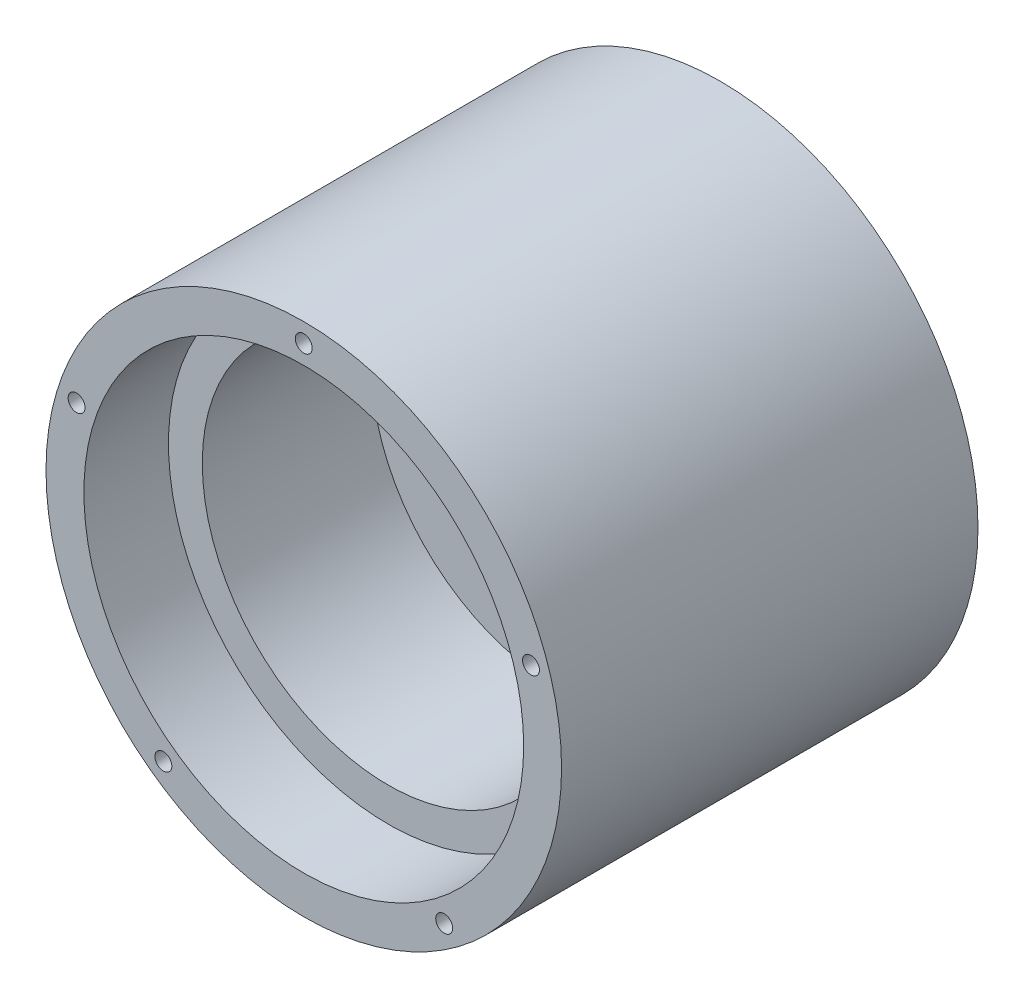
ISO-10303-21;
HEADER;
FILE_DESCRIPTION(('STEP AP214'),'2;1');
FILE_NAME('part.step','',(''),(''),'','','');
FILE_SCHEMA(('AUTOMOTIVE_DESIGN { 1 0 10303 214 1 1 1 1 }'));
ENDSEC;
DATA;
#1=APPLICATION_CONTEXT('core data for automotive mechanical design processes');
#2=APPLICATION_PROTOCOL_DEFINITION('international standard','automotive_design',2000,#1);
#3=PRODUCT_CONTEXT('',#1,'mechanical');
#4=PRODUCT('Part','Part','',(#3));
#5=PRODUCT_RELATED_PRODUCT_CATEGORY('part','',(#4));
#6=PRODUCT_DEFINITION_FORMATION('','',#4);
#7=PRODUCT_DEFINITION_CONTEXT('part definition',#1,'design');
#8=PRODUCT_DEFINITION('design','',#6,#7);
#9=PRODUCT_DEFINITION_SHAPE('','',#8);
#10=(LENGTH_UNIT() NAMED_UNIT(*) SI_UNIT(.MILLI.,.METRE.));
#11=(NAMED_UNIT(*) PLANE_ANGLE_UNIT() SI_UNIT($,.RADIAN.));
#12=(NAMED_UNIT(*) SI_UNIT($,.STERADIAN.) SOLID_ANGLE_UNIT());
#13=UNCERTAINTY_MEASURE_WITH_UNIT(LENGTH_MEASURE(1.E-05),#10,'distance_accuracy_value','');
#14=(GEOMETRIC_REPRESENTATION_CONTEXT(3) GLOBAL_UNCERTAINTY_ASSIGNED_CONTEXT((#13)) GLOBAL_UNIT_ASSIGNED_CONTEXT((#10,
#11,#12)) REPRESENTATION_CONTEXT('',''));
#15=CARTESIAN_POINT('',(0.,0.,0.));
#16=DIRECTION('',(0.,0.,1.));
#17=DIRECTION('',(1.,0.,0.));
#18=AXIS2_PLACEMENT_3D('',#15,#16,#17);
#19=CARTESIAN_POINT('',(0.,0.,85.));
#20=DIRECTION('',(0.,0.,-1.));
#21=DIRECTION('',(-1.,0.,0.));
#22=AXIS2_PLACEMENT_3D('',#19,#20,#21);
#23=CYLINDRICAL_SURFACE('',#22,76.2);
#24=CARTESIAN_POINT('',(0.,0.,85.));
#25=DIRECTION('',(0.,0.,1.));
#26=DIRECTION('',(1.,0.,0.));
#27=AXIS2_PLACEMENT_3D('',#24,#25,#26);
#28=CIRCLE('',#27,76.2);
#29=CARTESIAN_POINT('',(76.2,0.,85.));
#30=VERTEX_POINT('',#29);
#31=EDGE_CURVE('E338',#30,#30,#28,.T.);
#32=ORIENTED_EDGE('',*,*,#31,.F.);
#33=EDGE_LOOP('',(#32));
#34=FACE_BOUND('',#33,.T.);
#35=CARTESIAN_POINT('',(0.,0.,-38.1));
#36=DIRECTION('',(0.,0.,-1.));
#37=DIRECTION('',(-1.,0.,0.));
#38=AXIS2_PLACEMENT_3D('',#35,#36,#37);
#39=CIRCLE('',#38,76.2);
#40=CARTESIAN_POINT('',(-76.2,0.,-38.1));
#41=VERTEX_POINT('',#40);
#42=EDGE_CURVE('E294',#41,#41,#39,.T.);
#43=ORIENTED_EDGE('',*,*,#42,.F.);
#44=EDGE_LOOP('',(#43));
#45=FACE_BOUND('',#44,.T.);
#46=ADVANCED_FACE('F47',(#34,#45),#23,.T.);
#47=CARTESIAN_POINT('',(0.,0.,85.));
#48=DIRECTION('',(0.,0.,1.));
#49=DIRECTION('',(1.,0.,0.));
#50=AXIS2_PLACEMENT_3D('',#47,#48,#49);
#51=PLANE('',#50);
#52=CARTESIAN_POINT('',(-67.1560027286335,21.8203080068036,85.));
#53=DIRECTION('',(0.,0.,1.));
#54=DIRECTION('',(0.309016994374945,0.951056516295155,0.));
#55=AXIS2_PLACEMENT_3D('',#52,#53,#54);
#56=CIRCLE('',#55,2.5);
#57=CARTESIAN_POINT('',(-66.3834602426961,24.1979492975415,85.));
#58=VERTEX_POINT('',#57);
#59=EDGE_CURVE('E303',#58,#58,#56,.T.);
#60=ORIENTED_EDGE('',*,*,#59,.F.);
#61=EDGE_LOOP('',(#60));
#62=FACE_BOUND('',#61,.T.);
#63=CARTESIAN_POINT('',(-41.5046922348758,-57.126308006804,85.));
#64=DIRECTION('',(0.,0.,1.));
#65=DIRECTION('',(-0.809016994374951,0.587785252292469,0.));
#66=AXIS2_PLACEMENT_3D('',#63,#64,#65);
#67=CIRCLE('',#66,2.5);
#68=CARTESIAN_POINT('',(-43.5272347208132,-55.6568448760729,85.));
#69=VERTEX_POINT('',#68);
#70=EDGE_CURVE('E309',#69,#69,#67,.T.);
#71=ORIENTED_EDGE('',*,*,#70,.F.);
#72=EDGE_LOOP('',(#71));
#73=FACE_BOUND('',#72,.T.);
#74=CARTESIAN_POINT('',(41.5046922348766,-57.1263080068034,85.));
#75=DIRECTION('',(0.,0.,1.));
#76=DIRECTION('',(-0.809016994374942,-0.58778525229248,0.));
#77=AXIS2_PLACEMENT_3D('',#74,#75,#76);
#78=CIRCLE('',#77,2.5);
#79=CARTESIAN_POINT('',(39.4821497489393,-58.5957711375346,85.));
#80=VERTEX_POINT('',#79);
#81=EDGE_CURVE('E315',#80,#80,#78,.T.);
#82=ORIENTED_EDGE('',*,*,#81,.F.);
#83=EDGE_LOOP('',(#82));
#84=FACE_BOUND('',#83,.T.);
#85=CARTESIAN_POINT('',(67.1560027286331,21.8203080068045,85.));
#86=DIRECTION('',(0.,0.,1.));
#87=DIRECTION('',(0.309016994374958,-0.95105651629515,0.));
#88=AXIS2_PLACEMENT_3D('',#85,#86,#87);
#89=CIRCLE('',#88,2.5);
#90=CARTESIAN_POINT('',(67.9285452145705,19.4426667160667,85.));
#91=VERTEX_POINT('',#90);
#92=EDGE_CURVE('E298',#91,#91,#89,.T.);
#93=ORIENTED_EDGE('',*,*,#92,.F.);
#94=EDGE_LOOP('',(#93));
#95=FACE_BOUND('',#94,.T.);
#96=CARTESIAN_POINT('',(0.,70.612,85.));
#97=DIRECTION('',(0.,0.,1.));
#98=DIRECTION('',(1.,0.,0.));
#99=AXIS2_PLACEMENT_3D('',#96,#97,#98);
#100=CIRCLE('',#99,2.5);
#101=CARTESIAN_POINT('',(2.5,70.612,85.));
#102=VERTEX_POINT('',#101);
#103=EDGE_CURVE('E302',#102,#102,#100,.T.);
#104=ORIENTED_EDGE('',*,*,#103,.F.);
#105=EDGE_LOOP('',(#104));
#106=FACE_BOUND('',#105,.T.);
#107=CARTESIAN_POINT('',(0.,0.,85.));
#108=DIRECTION('',(0.,0.,1.));
#109=DIRECTION('',(1.,0.,0.));
#110=AXIS2_PLACEMENT_3D('',#107,#108,#109);
#111=CIRCLE('',#110,65.);
#112=CARTESIAN_POINT('',(65.,0.,85.));
#113=VERTEX_POINT('',#112);
#114=EDGE_CURVE('E332',#113,#113,#111,.T.);
#115=ORIENTED_EDGE('',*,*,#114,.F.);
#116=EDGE_LOOP('',(#115));
#117=FACE_BOUND('',#116,.T.);
#118=ORIENTED_EDGE('',*,*,#31,.T.);
#119=EDGE_LOOP('',(#118));
#120=FACE_BOUND('',#119,.T.);
#121=ADVANCED_FACE('F489',(#62,#73,#84,#95,#106,#117,#120),#51,.T.);
#122=CARTESIAN_POINT('',(0.,0.,60.));
#123=DIRECTION('',(0.,0.,1.));
#124=DIRECTION('',(1.,0.,0.));
#125=AXIS2_PLACEMENT_3D('',#122,#123,#124);
#126=CYLINDRICAL_SURFACE('',#125,65.);
#127=CARTESIAN_POINT('',(0.,0.,60.));
#128=DIRECTION('',(0.,0.,1.));
#129=DIRECTION('',(1.,0.,0.));
#130=AXIS2_PLACEMENT_3D('',#127,#128,#129);
#131=CIRCLE('',#130,65.);
#132=CARTESIAN_POINT('',(65.,0.,60.));
#133=VERTEX_POINT('',#132);
#134=EDGE_CURVE('E335',#133,#133,#131,.T.);
#135=ORIENTED_EDGE('',*,*,#134,.F.);
#136=EDGE_LOOP('',(#135));
#137=FACE_BOUND('',#136,.T.);
#138=ORIENTED_EDGE('',*,*,#114,.T.);
#139=EDGE_LOOP('',(#138));
#140=FACE_BOUND('',#139,.T.);
#141=ADVANCED_FACE('F494',(#137,#140),#126,.F.);
#142=CARTESIAN_POINT('',(0.,0.,60.));
#143=DIRECTION('',(0.,0.,1.));
#144=DIRECTION('',(1.,0.,0.));
#145=AXIS2_PLACEMENT_3D('',#142,#143,#144);
#146=PLANE('',#145);
#147=CARTESIAN_POINT('',(0.,0.,60.));
#148=DIRECTION('',(0.,0.,1.));
#149=DIRECTION('',(1.,0.,0.));
#150=AXIS2_PLACEMENT_3D('',#147,#148,#149);
#151=CIRCLE('',#150,55.);
#152=CARTESIAN_POINT('',(55.,0.,60.));
#153=VERTEX_POINT('',#152);
#154=EDGE_CURVE('E326',#153,#153,#151,.T.);
#155=ORIENTED_EDGE('',*,*,#154,.F.);
#156=EDGE_LOOP('',(#155));
#157=FACE_BOUND('',#156,.T.);
#158=ORIENTED_EDGE('',*,*,#134,.T.);
#159=EDGE_LOOP('',(#158));
#160=FACE_BOUND('',#159,.T.);
#161=ADVANCED_FACE('F502',(#157,#160),#146,.T.);
#162=CARTESIAN_POINT('',(0.,0.,10.));
#163=DIRECTION('',(0.,0.,1.));
#164=DIRECTION('',(1.,0.,0.));
#165=AXIS2_PLACEMENT_3D('',#162,#163,#164);
#166=CYLINDRICAL_SURFACE('',#165,55.);
#167=CARTESIAN_POINT('',(0.,0.,10.));
#168=DIRECTION('',(0.,0.,1.));
#169=DIRECTION('',(1.,0.,0.));
#170=AXIS2_PLACEMENT_3D('',#167,#168,#169);
#171=CIRCLE('',#170,55.);
#172=CARTESIAN_POINT('',(55.,0.,10.));
#173=VERTEX_POINT('',#172);
#174=EDGE_CURVE('E329',#173,#173,#171,.T.);
#175=ORIENTED_EDGE('',*,*,#174,.F.);
#176=EDGE_LOOP('',(#175));
#177=FACE_BOUND('',#176,.T.);
#178=ORIENTED_EDGE('',*,*,#154,.T.);
#179=EDGE_LOOP('',(#178));
#180=FACE_BOUND('',#179,.T.);
#181=ADVANCED_FACE('F614',(#177,#180),#166,.F.);
#182=CARTESIAN_POINT('',(0.,0.,10.));
#183=DIRECTION('',(0.,0.,1.));
#184=DIRECTION('',(1.,0.,0.));
#185=AXIS2_PLACEMENT_3D('',#182,#183,#184);
#186=PLANE('',#185);
#187=ORIENTED_EDGE('',*,*,#174,.T.);
#188=EDGE_LOOP('',(#187));
#189=FACE_BOUND('',#188,.T.);
#190=ADVANCED_FACE('F611',(#189),#186,.T.);
#191=CARTESIAN_POINT('',(0.,70.612,65.));
#192=DIRECTION('',(0.,0.,1.));
#193=DIRECTION('',(1.,0.,0.));
#194=AXIS2_PLACEMENT_3D('',#191,#192,#193);
#195=CYLINDRICAL_SURFACE('',#194,2.5);
#196=CARTESIAN_POINT('',(0.,70.612,65.));
#197=DIRECTION('',(0.,0.,1.));
#198=DIRECTION('',(1.,0.,0.));
#199=AXIS2_PLACEMENT_3D('',#196,#197,#198);
#200=CIRCLE('',#199,2.5);
#201=CARTESIAN_POINT('',(2.5,70.612,65.));
#202=VERTEX_POINT('',#201);
#203=EDGE_CURVE('E323',#202,#202,#200,.T.);
#204=ORIENTED_EDGE('',*,*,#203,.F.);
#205=EDGE_LOOP('',(#204));
#206=FACE_BOUND('',#205,.T.);
#207=ORIENTED_EDGE('',*,*,#103,.T.);
#208=EDGE_LOOP('',(#207));
#209=FACE_BOUND('',#208,.T.);
#210=ADVANCED_FACE('F607',(#206,#209),#195,.F.);
#211=CARTESIAN_POINT('',(0.,70.612,65.));
#212=DIRECTION('',(0.,0.,1.));
#213=DIRECTION('',(1.,0.,0.));
#214=AXIS2_PLACEMENT_3D('',#211,#212,#213);
#215=PLANE('',#214);
#216=ORIENTED_EDGE('',*,*,#203,.T.);
#217=EDGE_LOOP('',(#216));
#218=FACE_BOUND('',#217,.T.);
#219=ADVANCED_FACE('F603',(#218),#215,.T.);
#220=CARTESIAN_POINT('',(67.1560027286331,21.8203080068045,65.));
#221=DIRECTION('',(0.,0.,1.));
#222=DIRECTION('',(1.,0.,0.));
#223=AXIS2_PLACEMENT_3D('',#220,#221,#222);
#224=CYLINDRICAL_SURFACE('',#223,2.5);
#225=CARTESIAN_POINT('',(67.1560027286331,21.8203080068045,65.));
#226=DIRECTION('',(0.,0.,1.));
#227=DIRECTION('',(0.309016994374958,-0.95105651629515,0.));
#228=AXIS2_PLACEMENT_3D('',#225,#226,#227);
#229=CIRCLE('',#228,2.5);
#230=CARTESIAN_POINT('',(67.9285452145705,19.4426667160667,65.));
#231=VERTEX_POINT('',#230);
#232=EDGE_CURVE('E318',#231,#231,#229,.T.);
#233=ORIENTED_EDGE('',*,*,#232,.F.);
#234=EDGE_LOOP('',(#233));
#235=FACE_BOUND('',#234,.T.);
#236=ORIENTED_EDGE('',*,*,#92,.T.);
#237=EDGE_LOOP('',(#236));
#238=FACE_BOUND('',#237,.T.);
#239=ADVANCED_FACE('F599',(#235,#238),#224,.F.);
#240=CARTESIAN_POINT('',(67.1560027286331,21.8203080068045,65.));
#241=DIRECTION('',(0.,0.,1.));
#242=DIRECTION('',(0.309016994374958,-0.95105651629515,0.));
#243=AXIS2_PLACEMENT_3D('',#240,#241,#242);
#244=PLANE('',#243);
#245=ORIENTED_EDGE('',*,*,#232,.T.);
#246=EDGE_LOOP('',(#245));
#247=FACE_BOUND('',#246,.T.);
#248=ADVANCED_FACE('F595',(#247),#244,.T.);
#249=CARTESIAN_POINT('',(41.5046922348766,-57.1263080068034,65.));
#250=DIRECTION('',(0.,0.,1.));
#251=DIRECTION('',(1.,0.,0.));
#252=AXIS2_PLACEMENT_3D('',#249,#250,#251);
#253=CYLINDRICAL_SURFACE('',#252,2.5);
#254=CARTESIAN_POINT('',(41.5046922348766,-57.1263080068034,65.));
#255=DIRECTION('',(0.,0.,1.));
#256=DIRECTION('',(-0.809016994374942,-0.58778525229248,0.));
#257=AXIS2_PLACEMENT_3D('',#254,#255,#256);
#258=CIRCLE('',#257,2.5);
#259=CARTESIAN_POINT('',(39.4821497489393,-58.5957711375346,65.));
#260=VERTEX_POINT('',#259);
#261=EDGE_CURVE('E312',#260,#260,#258,.T.);
#262=ORIENTED_EDGE('',*,*,#261,.F.);
#263=EDGE_LOOP('',(#262));
#264=FACE_BOUND('',#263,.T.);
#265=ORIENTED_EDGE('',*,*,#81,.T.);
#266=EDGE_LOOP('',(#265));
#267=FACE_BOUND('',#266,.T.);
#268=ADVANCED_FACE('F591',(#264,#267),#253,.F.);
#269=CARTESIAN_POINT('',(41.5046922348766,-57.1263080068034,65.));
#270=DIRECTION('',(0.,0.,1.));
#271=DIRECTION('',(-0.809016994374942,-0.58778525229248,0.));
#272=AXIS2_PLACEMENT_3D('',#269,#270,#271);
#273=PLANE('',#272);
#274=ORIENTED_EDGE('',*,*,#261,.T.);
#275=EDGE_LOOP('',(#274));
#276=FACE_BOUND('',#275,.T.);
#277=ADVANCED_FACE('F587',(#276),#273,.T.);
#278=CARTESIAN_POINT('',(-41.5046922348758,-57.126308006804,65.));
#279=DIRECTION('',(0.,0.,1.));
#280=DIRECTION('',(1.,0.,0.));
#281=AXIS2_PLACEMENT_3D('',#278,#279,#280);
#282=CYLINDRICAL_SURFACE('',#281,2.5);
#283=CARTESIAN_POINT('',(-41.5046922348758,-57.126308006804,65.));
#284=DIRECTION('',(0.,0.,1.));
#285=DIRECTION('',(-0.809016994374951,0.587785252292469,0.));
#286=AXIS2_PLACEMENT_3D('',#283,#284,#285);
#287=CIRCLE('',#286,2.5);
#288=CARTESIAN_POINT('',(-43.5272347208132,-55.6568448760729,65.));
#289=VERTEX_POINT('',#288);
#290=EDGE_CURVE('E306',#289,#289,#287,.T.);
#291=ORIENTED_EDGE('',*,*,#290,.F.);
#292=EDGE_LOOP('',(#291));
#293=FACE_BOUND('',#292,.T.);
#294=ORIENTED_EDGE('',*,*,#70,.T.);
#295=EDGE_LOOP('',(#294));
#296=FACE_BOUND('',#295,.T.);
#297=ADVANCED_FACE('F583',(#293,#296),#282,.F.);
#298=CARTESIAN_POINT('',(-41.5046922348758,-57.126308006804,65.));
#299=DIRECTION('',(0.,0.,1.));
#300=DIRECTION('',(-0.809016994374951,0.587785252292469,0.));
#301=AXIS2_PLACEMENT_3D('',#298,#299,#300);
#302=PLANE('',#301);
#303=ORIENTED_EDGE('',*,*,#290,.T.);
#304=EDGE_LOOP('',(#303));
#305=FACE_BOUND('',#304,.T.);
#306=ADVANCED_FACE('F579',(#305),#302,.T.);
#307=CARTESIAN_POINT('',(-67.1560027286335,21.8203080068036,65.));
#308=DIRECTION('',(0.,0.,1.));
#309=DIRECTION('',(1.,0.,0.));
#310=AXIS2_PLACEMENT_3D('',#307,#308,#309);
#311=CYLINDRICAL_SURFACE('',#310,2.5);
#312=CARTESIAN_POINT('',(-67.1560027286335,21.8203080068036,65.));
#313=DIRECTION('',(0.,0.,1.));
#314=DIRECTION('',(0.309016994374945,0.951056516295155,0.));
#315=AXIS2_PLACEMENT_3D('',#312,#313,#314);
#316=CIRCLE('',#315,2.5);
#317=CARTESIAN_POINT('',(-66.3834602426961,24.1979492975415,65.));
#318=VERTEX_POINT('',#317);
#319=EDGE_CURVE('E299',#318,#318,#316,.T.);
#320=ORIENTED_EDGE('',*,*,#319,.F.);
#321=EDGE_LOOP('',(#320));
#322=FACE_BOUND('',#321,.T.);
#323=ORIENTED_EDGE('',*,*,#59,.T.);
#324=EDGE_LOOP('',(#323));
#325=FACE_BOUND('',#324,.T.);
#326=ADVANCED_FACE('F575',(#322,#325),#311,.F.);
#327=CARTESIAN_POINT('',(-67.1560027286335,21.8203080068036,65.));
#328=DIRECTION('',(0.,0.,1.));
#329=DIRECTION('',(0.309016994374945,0.951056516295155,0.));
#330=AXIS2_PLACEMENT_3D('',#327,#328,#329);
#331=PLANE('',#330);
#332=ORIENTED_EDGE('',*,*,#319,.T.);
#333=EDGE_LOOP('',(#332));
#334=FACE_BOUND('',#333,.T.);
#335=ADVANCED_FACE('F484',(#334),#331,.T.);
#336=CARTESIAN_POINT('',(0.,0.,-38.1));
#337=DIRECTION('',(0.,0.,-1.));
#338=DIRECTION('',(-1.,0.,0.));
#339=AXIS2_PLACEMENT_3D('',#336,#337,#338);
#340=PLANE('',#339);
#341=CARTESIAN_POINT('',(0.,0.,-38.1));
#342=DIRECTION('',(0.,0.,-1.));
#343=DIRECTION('',(-1.,0.,0.));
#344=AXIS2_PLACEMENT_3D('',#341,#342,#343);
#345=CIRCLE('',#344,69.85);
#346=CARTESIAN_POINT('',(-69.85,0.,-38.1));
#347=VERTEX_POINT('',#346);
#348=EDGE_CURVE('E469',#347,#347,#345,.T.);
#349=ORIENTED_EDGE('',*,*,#348,.F.);
#350=EDGE_LOOP('',(#349));
#351=FACE_BOUND('',#350,.T.);
#352=ORIENTED_EDGE('',*,*,#42,.T.);
#353=EDGE_LOOP('',(#352));
#354=FACE_BOUND('',#353,.T.);
#355=ADVANCED_FACE('F478',(#351,#354),#340,.T.);
#356=CARTESIAN_POINT('',(0.,0.,-12.7));
#357=DIRECTION('',(0.,0.,-1.));
#358=DIRECTION('',(-1.,0.,0.));
#359=AXIS2_PLACEMENT_3D('',#356,#357,#358);
#360=CYLINDRICAL_SURFACE('',#359,69.85);
#361=CARTESIAN_POINT('',(0.,0.,-12.7));
#362=DIRECTION('',(0.,0.,-1.));
#363=DIRECTION('',(-1.,0.,0.));
#364=AXIS2_PLACEMENT_3D('',#361,#362,#363);
#365=CIRCLE('',#364,69.85);
#366=CARTESIAN_POINT('',(-69.85,0.,-12.7));
#367=VERTEX_POINT('',#366);
#368=EDGE_CURVE('E216',#367,#367,#365,.T.);
#369=ORIENTED_EDGE('',*,*,#368,.F.);
#370=EDGE_LOOP('',(#369));
#371=FACE_BOUND('',#370,.T.);
#372=ORIENTED_EDGE('',*,*,#348,.T.);
#373=EDGE_LOOP('',(#372));
#374=FACE_BOUND('',#373,.T.);
#375=ADVANCED_FACE('F475',(#371,#374),#360,.F.);
#376=CARTESIAN_POINT('',(0.,0.,-12.7));
#377=DIRECTION('',(0.,0.,-1.));
#378=DIRECTION('',(-1.,0.,0.));
#379=AXIS2_PLACEMENT_3D('',#376,#377,#378);
#380=PLANE('',#379);
#381=DIRECTION('',(1.,0.,0.));
#382=VECTOR('',#381,1.);
#383=CARTESIAN_POINT('',(66.04,-6.34999999999977,-12.7));
#384=LINE('',#383,#382);
#385=CARTESIAN_POINT('',(-66.0399999999999,-6.35000000000023,-12.7));
#386=VERTEX_POINT('',#385);
#387=CARTESIAN_POINT('',(-50.4015624757804,-6.35000000000033,-12.7));
#388=VERTEX_POINT('',#387);
#389=EDGE_CURVE('E443',#386,#388,#384,.T.);
#390=ORIENTED_EDGE('',*,*,#389,.T.);
#391=CARTESIAN_POINT('',(0.,0.,-12.7));
#392=DIRECTION('',(0.,0.,-1.));
#393=DIRECTION('',(-1.,0.,0.));
#394=AXIS2_PLACEMENT_3D('',#391,#392,#393);
#395=CIRCLE('',#394,50.8);
#396=CARTESIAN_POINT('',(-6.35,-50.4015624757804,-12.7));
#397=VERTEX_POINT('',#396);
#398=EDGE_CURVE('E447',#397,#388,#395,.T.);
#399=ORIENTED_EDGE('',*,*,#398,.F.);
#400=DIRECTION('',(0.,-1.,0.));
#401=VECTOR('',#400,1.);
#402=CARTESIAN_POINT('',(-6.35,-66.04,-12.7));
#403=LINE('',#402,#401);
#404=CARTESIAN_POINT('',(-6.35,-66.04,-12.7));
#405=VERTEX_POINT('',#404);
#406=EDGE_CURVE('E451',#397,#405,#403,.T.);
#407=ORIENTED_EDGE('',*,*,#406,.T.);
#408=DIRECTION('',(-1.,0.,0.));
#409=VECTOR('',#408,1.);
#410=CARTESIAN_POINT('',(0.,-66.04,-12.7));
#411=LINE('',#410,#409);
#412=CARTESIAN_POINT('',(6.34999999999997,-66.04,-12.7));
#413=VERTEX_POINT('',#412);
#414=EDGE_CURVE('E453',#413,#405,#411,.T.);
#415=ORIENTED_EDGE('',*,*,#414,.F.);
#416=DIRECTION('',(0.,1.,0.));
#417=VECTOR('',#416,1.);
#418=CARTESIAN_POINT('',(6.34999999999997,-66.04,-12.7));
#419=LINE('',#418,#417);
#420=CARTESIAN_POINT('',(6.34999999999997,-50.4015624757805,-12.7));
#421=VERTEX_POINT('',#420);
#422=EDGE_CURVE('E460',#413,#421,#419,.T.);
#423=ORIENTED_EDGE('',*,*,#422,.T.);
#424=CARTESIAN_POINT('',(0.,0.,-12.7));
#425=DIRECTION('',(0.,0.,-1.));
#426=DIRECTION('',(-1.,0.,0.));
#427=AXIS2_PLACEMENT_3D('',#424,#425,#426);
#428=CIRCLE('',#427,50.8);
#429=CARTESIAN_POINT('',(50.4015624757805,-6.34999999999982,-12.7));
#430=VERTEX_POINT('',#429);
#431=EDGE_CURVE('E464',#430,#421,#428,.T.);
#432=ORIENTED_EDGE('',*,*,#431,.F.);
#433=DIRECTION('',(1.,0.,0.));
#434=VECTOR('',#433,1.);
#435=CARTESIAN_POINT('',(66.04,-6.34999999999977,-12.7));
#436=LINE('',#435,#434);
#437=CARTESIAN_POINT('',(66.04,-6.34999999999977,-12.7));
#438=VERTEX_POINT('',#437);
#439=EDGE_CURVE('E61',#430,#438,#436,.T.);
#440=ORIENTED_EDGE('',*,*,#439,.T.);
#441=DIRECTION('',(0.,-1.,0.));
#442=VECTOR('',#441,1.);
#443=CARTESIAN_POINT('',(66.04,2.30577427617201E-13,-12.7));
#444=LINE('',#443,#442);
#445=CARTESIAN_POINT('',(66.04,6.3500000000002,-12.7));
#446=VERTEX_POINT('',#445);
#447=EDGE_CURVE('E11',#446,#438,#444,.T.);
#448=ORIENTED_EDGE('',*,*,#447,.F.);
#449=DIRECTION('',(-1.,0.,0.));
#450=VECTOR('',#449,1.);
#451=CARTESIAN_POINT('',(66.04,6.3500000000002,-12.7));
#452=LINE('',#451,#450);
#453=CARTESIAN_POINT('',(50.4015624757804,6.35000000000014,-12.7));
#454=VERTEX_POINT('',#453);
#455=EDGE_CURVE('E207',#446,#454,#452,.T.);
#456=ORIENTED_EDGE('',*,*,#455,.T.);
#457=CARTESIAN_POINT('',(0.,0.,-12.7));
#458=DIRECTION('',(0.,0.,-1.));
#459=DIRECTION('',(-1.,0.,0.));
#460=AXIS2_PLACEMENT_3D('',#457,#458,#459);
#461=CIRCLE('',#460,50.8);
#462=CARTESIAN_POINT('',(6.35,50.4015624757804,-12.7));
#463=VERTEX_POINT('',#462);
#464=EDGE_CURVE('E466',#463,#454,#461,.T.);
#465=ORIENTED_EDGE('',*,*,#464,.F.);
#466=DIRECTION('',(0.,1.,0.));
#467=VECTOR('',#466,1.);
#468=CARTESIAN_POINT('',(6.35,66.04,-12.7));
#469=LINE('',#468,#467);
#470=CARTESIAN_POINT('',(6.35,66.04,-12.7));
#471=VERTEX_POINT('',#470);
#472=EDGE_CURVE('E462',#463,#471,#469,.T.);
#473=ORIENTED_EDGE('',*,*,#472,.T.);
#474=DIRECTION('',(1.,0.,0.));
#475=VECTOR('',#474,1.);
#476=CARTESIAN_POINT('',(0.,66.04,-12.7));
#477=LINE('',#476,#475);
#478=CARTESIAN_POINT('',(-6.34999999999997,66.04,-12.7));
#479=VERTEX_POINT('',#478);
#480=EDGE_CURVE('E457',#479,#471,#477,.T.);
#481=ORIENTED_EDGE('',*,*,#480,.F.);
#482=DIRECTION('',(0.,-1.,0.));
#483=VECTOR('',#482,1.);
#484=CARTESIAN_POINT('',(-6.34999999999997,66.04,-12.7));
#485=LINE('',#484,#483);
#486=CARTESIAN_POINT('',(-6.34999999999997,50.4015624757804,-12.7));
#487=VERTEX_POINT('',#486);
#488=EDGE_CURVE('E394',#479,#487,#485,.T.);
#489=ORIENTED_EDGE('',*,*,#488,.T.);
#490=CARTESIAN_POINT('',(0.,0.,-12.7));
#491=DIRECTION('',(0.,0.,-1.));
#492=DIRECTION('',(-1.,0.,0.));
#493=AXIS2_PLACEMENT_3D('',#490,#491,#492);
#494=CIRCLE('',#493,50.8);
#495=CARTESIAN_POINT('',(-50.4015624757805,6.34999999999947,-12.7));
#496=VERTEX_POINT('',#495);
#497=EDGE_CURVE('E390',#496,#487,#494,.T.);
#498=ORIENTED_EDGE('',*,*,#497,.F.);
#499=DIRECTION('',(-1.,0.,0.));
#500=VECTOR('',#499,1.);
#501=CARTESIAN_POINT('',(-66.0400000000001,6.34999999999931,-12.7));
#502=LINE('',#501,#500);
#503=CARTESIAN_POINT('',(-66.0400000000001,6.34999999999931,-12.7));
#504=VERTEX_POINT('',#503);
#505=EDGE_CURVE('E445',#496,#504,#502,.T.);
#506=ORIENTED_EDGE('',*,*,#505,.T.);
#507=DIRECTION('',(0.,1.,0.));
#508=VECTOR('',#507,1.);
#509=CARTESIAN_POINT('',(-66.04,-6.91732282851602E-13,-12.7));
#510=LINE('',#509,#508);
#511=EDGE_CURVE('E440',#386,#504,#510,.T.);
#512=ORIENTED_EDGE('',*,*,#511,.F.);
#513=EDGE_LOOP('',(#390,#399,#407,#415,#423,#432,#440,#448,#456,#465,#473,#481,#489,#498,#506,#512));
#514=FACE_BOUND('',#513,.T.);
#515=ORIENTED_EDGE('',*,*,#368,.T.);
#516=EDGE_LOOP('',(#515));
#517=FACE_BOUND('',#516,.T.);
#518=ADVANCED_FACE('F205',(#514,#517),#380,.T.);
#519=CARTESIAN_POINT('',(-26.7090251154211,-66.04,-6.34999999999997));
#520=DIRECTION('',(-1.,0.,0.));
#521=DIRECTION('',(0.,0.,1.));
#522=AXIS2_PLACEMENT_3D('',#519,#520,#521);
#523=PLANE('',#522);
#524=DIRECTION('',(0.,0.,1.));
#525=VECTOR('',#524,1.);
#526=CARTESIAN_POINT('',(-26.7090251154211,-43.2118962484152,-38.1));
#527=LINE('',#526,#525);
#528=CARTESIAN_POINT('',(-26.7090251154211,-43.2118962484152,-6.34999999999997));
#529=VERTEX_POINT('',#528);
#530=CARTESIAN_POINT('',(-26.7090251154211,-43.2118962484152,0.));
#531=VERTEX_POINT('',#530);
#532=EDGE_CURVE('E288',#529,#531,#527,.T.);
#533=ORIENTED_EDGE('',*,*,#532,.T.);
#534=DIRECTION('',(0.,1.,0.));
#535=VECTOR('',#534,1.);
#536=CARTESIAN_POINT('',(-26.7090251154211,-66.04,0.));
#537=LINE('',#536,#535);
#538=CARTESIAN_POINT('',(-26.7090251154211,-66.04,0.));
#539=VERTEX_POINT('',#538);
#540=EDGE_CURVE('E274',#539,#531,#537,.T.);
#541=ORIENTED_EDGE('',*,*,#540,.F.);
#542=DIRECTION('',(0.,0.,1.));
#543=VECTOR('',#542,1.);
#544=CARTESIAN_POINT('',(-26.7090251154211,-66.04,-6.34999999999997));
#545=LINE('',#544,#543);
#546=CARTESIAN_POINT('',(-26.7090251154211,-66.04,-6.34999999999997));
#547=VERTEX_POINT('',#546);
#548=EDGE_CURVE('E270',#547,#539,#545,.T.);
#549=ORIENTED_EDGE('',*,*,#548,.F.);
#550=DIRECTION('',(0.,1.,0.));
#551=VECTOR('',#550,1.);
#552=CARTESIAN_POINT('',(-26.7090251154211,-66.04,-6.34999999999997));
#553=LINE('',#552,#551);
#554=EDGE_CURVE('E278',#547,#529,#553,.T.);
#555=ORIENTED_EDGE('',*,*,#554,.T.);
#556=EDGE_LOOP('',(#533,#541,#549,#555));
#557=FACE_BOUND('',#556,.T.);
#558=ADVANCED_FACE('F553',(#557),#523,.F.);
#559=CARTESIAN_POINT('',(-6.35,-66.04,-6.34999999999997));
#560=DIRECTION('',(0.,0.,-1.));
#561=DIRECTION('',(-1.,0.,0.));
#562=AXIS2_PLACEMENT_3D('',#559,#560,#561);
#563=PLANE('',#562);
#564=CARTESIAN_POINT('',(0.,0.,-6.34999999999997));
#565=DIRECTION('',(0.,0.,-1.));
#566=DIRECTION('',(-1.,0.,0.));
#567=AXIS2_PLACEMENT_3D('',#564,#565,#566);
#568=CIRCLE('',#567,50.8);
#569=CARTESIAN_POINT('',(-6.35,-50.4015624757804,-6.34999999999997));
#570=VERTEX_POINT('',#569);
#571=EDGE_CURVE('E345',#570,#529,#568,.T.);
#572=ORIENTED_EDGE('',*,*,#571,.T.);
#573=ORIENTED_EDGE('',*,*,#554,.F.);
#574=DIRECTION('',(-1.,0.,0.));
#575=VECTOR('',#574,1.);
#576=CARTESIAN_POINT('',(-6.35,-66.04,-6.34999999999997));
#577=LINE('',#576,#575);
#578=CARTESIAN_POINT('',(-6.35,-66.04,-6.34999999999997));
#579=VERTEX_POINT('',#578);
#580=EDGE_CURVE('E267',#579,#547,#577,.T.);
#581=ORIENTED_EDGE('',*,*,#580,.F.);
#582=DIRECTION('',(0.,1.,0.));
#583=VECTOR('',#582,1.);
#584=CARTESIAN_POINT('',(-6.35,-66.04,-6.34999999999997));
#585=LINE('',#584,#583);
#586=EDGE_CURVE('E281',#579,#570,#585,.T.);
#587=ORIENTED_EDGE('',*,*,#586,.T.);
#588=EDGE_LOOP('',(#572,#573,#581,#587));
#589=FACE_BOUND('',#588,.T.);
#590=ADVANCED_FACE('F556',(#589),#563,.F.);
#591=CARTESIAN_POINT('',(-66.0400000000003,26.7090251154205,-6.34999999999997));
#592=DIRECTION('',(0.,1.,0.));
#593=DIRECTION('',(-1.,0.,0.));
#594=AXIS2_PLACEMENT_3D('',#591,#592,#593);
#595=PLANE('',#594);
#596=DIRECTION('',(0.,0.,1.));
#597=VECTOR('',#596,1.);
#598=CARTESIAN_POINT('',(-43.2118962484155,26.7090251154207,-38.1));
#599=LINE('',#598,#597);
#600=CARTESIAN_POINT('',(-43.2118962484155,26.7090251154207,-6.34999999999997));
#601=VERTEX_POINT('',#600);
#602=CARTESIAN_POINT('',(-43.2118962484155,26.7090251154207,0.));
#603=VERTEX_POINT('',#602);
#604=EDGE_CURVE('E237',#601,#603,#599,.T.);
#605=ORIENTED_EDGE('',*,*,#604,.T.);
#606=DIRECTION('',(1.,0.,0.));
#607=VECTOR('',#606,1.);
#608=CARTESIAN_POINT('',(-66.0400000000003,26.7090251154205,0.));
#609=LINE('',#608,#607);
#610=CARTESIAN_POINT('',(-66.0400000000003,26.7090251154205,0.));
#611=VERTEX_POINT('',#610);
#612=EDGE_CURVE('E382',#611,#603,#609,.T.);
#613=ORIENTED_EDGE('',*,*,#612,.F.);
#614=DIRECTION('',(0.,0.,1.));
#615=VECTOR('',#614,1.);
#616=CARTESIAN_POINT('',(-66.0400000000003,26.7090251154205,-6.34999999999997));
#617=LINE('',#616,#615);
#618=CARTESIAN_POINT('',(-66.0400000000003,26.7090251154205,-6.34999999999997));
#619=VERTEX_POINT('',#618);
#620=EDGE_CURVE('E420',#619,#611,#617,.T.);
#621=ORIENTED_EDGE('',*,*,#620,.F.);
#622=DIRECTION('',(1.,0.,0.));
#623=VECTOR('',#622,1.);
#624=CARTESIAN_POINT('',(-66.0400000000003,26.7090251154205,-6.34999999999997));
#625=LINE('',#624,#623);
#626=EDGE_CURVE('E423',#619,#601,#625,.T.);
#627=ORIENTED_EDGE('',*,*,#626,.T.);
#628=EDGE_LOOP('',(#605,#613,#621,#627));
#629=FACE_BOUND('',#628,.T.);
#630=ADVANCED_FACE('F560',(#629),#595,.F.);
#631=CARTESIAN_POINT('',(-66.0400000000001,6.3499999999993,-6.34999999999997));
#632=DIRECTION('',(0.,0.,-1.));
#633=DIRECTION('',(-1.,0.,0.));
#634=AXIS2_PLACEMENT_3D('',#631,#632,#633);
#635=PLANE('',#634);
#636=CARTESIAN_POINT('',(0.,0.,-6.34999999999997));
#637=DIRECTION('',(0.,0.,-1.));
#638=DIRECTION('',(-1.,0.,0.));
#639=AXIS2_PLACEMENT_3D('',#636,#637,#638);
#640=CIRCLE('',#639,50.8);
#641=CARTESIAN_POINT('',(-50.4015624757805,6.34999999999947,-6.34999999999997));
#642=VERTEX_POINT('',#641);
#643=EDGE_CURVE('E349',#642,#601,#640,.T.);
#644=ORIENTED_EDGE('',*,*,#643,.T.);
#645=ORIENTED_EDGE('',*,*,#626,.F.);
#646=DIRECTION('',(0.,1.,0.));
#647=VECTOR('',#646,1.);
#648=CARTESIAN_POINT('',(-66.0400000000001,6.3499999999993,-6.34999999999997));
#649=LINE('',#648,#647);
#650=CARTESIAN_POINT('',(-66.0400000000001,6.3499999999993,-6.34999999999997));
#651=VERTEX_POINT('',#650);
#652=EDGE_CURVE('E429',#651,#619,#649,.T.);
#653=ORIENTED_EDGE('',*,*,#652,.F.);
#654=DIRECTION('',(1.,0.,0.));
#655=VECTOR('',#654,1.);
#656=CARTESIAN_POINT('',(-66.0400000000001,6.3499999999993,-6.34999999999997));
#657=LINE('',#656,#655);
#658=EDGE_CURVE('E419',#651,#642,#657,.T.);
#659=ORIENTED_EDGE('',*,*,#658,.T.);
#660=EDGE_LOOP('',(#644,#645,#653,#659));
#661=FACE_BOUND('',#660,.T.);
#662=ADVANCED_FACE('F523',(#661),#635,.F.);
#663=CARTESIAN_POINT('',(26.7090251154211,66.04,-6.34999999999997));
#664=DIRECTION('',(1.,0.,0.));
#665=DIRECTION('',(0.,0.,-1.));
#666=AXIS2_PLACEMENT_3D('',#663,#664,#665);
#667=PLANE('',#666);
#668=DIRECTION('',(0.,0.,1.));
#669=VECTOR('',#668,1.);
#670=CARTESIAN_POINT('',(26.7090251154211,43.2118962484152,-38.1));
#671=LINE('',#670,#669);
#672=CARTESIAN_POINT('',(26.7090251154211,43.2118962484152,-6.34999999999997));
#673=VERTEX_POINT('',#672);
#674=CARTESIAN_POINT('',(26.7090251154211,43.2118962484152,0.));
#675=VERTEX_POINT('',#674);
#676=EDGE_CURVE('E249',#673,#675,#671,.T.);
#677=ORIENTED_EDGE('',*,*,#676,.T.);
#678=DIRECTION('',(0.,-1.,0.));
#679=VECTOR('',#678,1.);
#680=CARTESIAN_POINT('',(26.7090251154211,66.04,0.));
#681=LINE('',#680,#679);
#682=CARTESIAN_POINT('',(26.7090251154211,66.04,0.));
#683=VERTEX_POINT('',#682);
#684=EDGE_CURVE('E226',#683,#675,#681,.T.);
#685=ORIENTED_EDGE('',*,*,#684,.F.);
#686=DIRECTION('',(0.,0.,1.));
#687=VECTOR('',#686,1.);
#688=CARTESIAN_POINT('',(26.7090251154211,66.04,-6.34999999999997));
#689=LINE('',#688,#687);
#690=CARTESIAN_POINT('',(26.7090251154211,66.04,-6.34999999999997));
#691=VERTEX_POINT('',#690);
#692=EDGE_CURVE('E399',#691,#683,#689,.T.);
#693=ORIENTED_EDGE('',*,*,#692,.F.);
#694=DIRECTION('',(0.,-1.,0.));
#695=VECTOR('',#694,1.);
#696=CARTESIAN_POINT('',(26.7090251154211,66.04,-6.34999999999997));
#697=LINE('',#696,#695);
#698=EDGE_CURVE('E401',#691,#673,#697,.T.);
#699=ORIENTED_EDGE('',*,*,#698,.T.);
#700=EDGE_LOOP('',(#677,#685,#693,#699));
#701=FACE_BOUND('',#700,.T.);
#702=ADVANCED_FACE('F516',(#701),#667,.F.);
#703=CARTESIAN_POINT('',(6.35,66.04,-6.34999999999997));
#704=DIRECTION('',(0.,0.,-1.));
#705=DIRECTION('',(-1.,0.,0.));
#706=AXIS2_PLACEMENT_3D('',#703,#704,#705);
#707=PLANE('',#706);
#708=CARTESIAN_POINT('',(0.,0.,-6.34999999999997));
#709=DIRECTION('',(0.,0.,-1.));
#710=DIRECTION('',(-1.,0.,0.));
#711=AXIS2_PLACEMENT_3D('',#708,#709,#710);
#712=CIRCLE('',#711,50.8);
#713=CARTESIAN_POINT('',(6.35,50.4015624757804,-6.34999999999997));
#714=VERTEX_POINT('',#713);
#715=EDGE_CURVE('E353',#714,#673,#712,.T.);
#716=ORIENTED_EDGE('',*,*,#715,.T.);
#717=ORIENTED_EDGE('',*,*,#698,.F.);
#718=DIRECTION('',(1.,0.,0.));
#719=VECTOR('',#718,1.);
#720=CARTESIAN_POINT('',(6.35,66.04,-6.34999999999997));
#721=LINE('',#720,#719);
#722=CARTESIAN_POINT('',(6.35,66.04,-6.34999999999997));
#723=VERTEX_POINT('',#722);
#724=EDGE_CURVE('E404',#723,#691,#721,.T.);
#725=ORIENTED_EDGE('',*,*,#724,.F.);
#726=DIRECTION('',(0.,-1.,0.));
#727=VECTOR('',#726,1.);
#728=CARTESIAN_POINT('',(6.35,66.04,-6.34999999999997));
#729=LINE('',#728,#727);
#730=EDGE_CURVE('E398',#723,#714,#729,.T.);
#731=ORIENTED_EDGE('',*,*,#730,.T.);
#732=EDGE_LOOP('',(#716,#717,#725,#731));
#733=FACE_BOUND('',#732,.T.);
#734=ADVANCED_FACE('F509',(#733),#707,.F.);
#735=CARTESIAN_POINT('',(0.,0.,0.));
#736=DIRECTION('',(0.,0.,1.));
#737=DIRECTION('',(1.,0.,0.));
#738=AXIS2_PLACEMENT_3D('',#735,#736,#737);
#739=PLANE('',#738);
#740=CARTESIAN_POINT('',(0.,0.,0.));
#741=DIRECTION('',(0.,0.,-1.));
#742=DIRECTION('',(-1.,0.,0.));
#743=AXIS2_PLACEMENT_3D('',#740,#741,#742);
#744=CIRCLE('',#743,50.8);
#745=CARTESIAN_POINT('',(50.4015624757804,6.35000000000014,0.));
#746=VERTEX_POINT('',#745);
#747=EDGE_CURVE('E370',#675,#746,#744,.T.);
#748=ORIENTED_EDGE('',*,*,#747,.T.);
#749=DIRECTION('',(-1.,0.,0.));
#750=VECTOR('',#749,1.);
#751=CARTESIAN_POINT('',(66.04,6.3500000000002,0.));
#752=LINE('',#751,#750);
#753=CARTESIAN_POINT('',(66.04,6.3500000000002,0.));
#754=VERTEX_POINT('',#753);
#755=EDGE_CURVE('E68',#754,#746,#752,.T.);
#756=ORIENTED_EDGE('',*,*,#755,.F.);
#757=DIRECTION('',(0.,1.,0.));
#758=VECTOR('',#757,1.);
#759=CARTESIAN_POINT('',(66.0400000000001,-26.7090251154209,0.));
#760=LINE('',#759,#758);
#761=CARTESIAN_POINT('',(66.0400000000001,-26.7090251154209,0.));
#762=VERTEX_POINT('',#761);
#763=EDGE_CURVE('E221',#762,#754,#760,.T.);
#764=ORIENTED_EDGE('',*,*,#763,.F.);
#765=DIRECTION('',(-1.,0.,0.));
#766=VECTOR('',#765,1.);
#767=CARTESIAN_POINT('',(66.0400000000001,-26.7090251154209,0.));
#768=LINE('',#767,#766);
#769=CARTESIAN_POINT('',(43.2118962484153,-26.709025115421,0.));
#770=VERTEX_POINT('',#769);
#771=EDGE_CURVE('E234',#762,#770,#768,.T.);
#772=ORIENTED_EDGE('',*,*,#771,.T.);
#773=CARTESIAN_POINT('',(6.34999999999997,-50.4015624757805,0.));
#774=VERTEX_POINT('',#773);
#775=EDGE_CURVE('E290',#770,#774,#744,.T.);
#776=ORIENTED_EDGE('',*,*,#775,.T.);
#777=DIRECTION('',(0.,1.,0.));
#778=VECTOR('',#777,1.);
#779=CARTESIAN_POINT('',(6.34999999999997,-66.04,0.));
#780=LINE('',#779,#778);
#781=CARTESIAN_POINT('',(6.34999999999997,-66.04,0.));
#782=VERTEX_POINT('',#781);
#783=EDGE_CURVE('E273',#782,#774,#780,.T.);
#784=ORIENTED_EDGE('',*,*,#783,.F.);
#785=DIRECTION('',(1.,0.,0.));
#786=VECTOR('',#785,1.);
#787=CARTESIAN_POINT('',(-26.7090251154211,-66.04,0.));
#788=LINE('',#787,#786);
#789=EDGE_CURVE('E259',#539,#782,#788,.T.);
#790=ORIENTED_EDGE('',*,*,#789,.F.);
#791=ORIENTED_EDGE('',*,*,#540,.T.);
#792=CARTESIAN_POINT('',(-50.4015624757804,-6.3500000000005,0.));
#793=VERTEX_POINT('',#792);
#794=EDGE_CURVE('E291',#531,#793,#744,.T.);
#795=ORIENTED_EDGE('',*,*,#794,.T.);
#796=DIRECTION('',(1.,0.,0.));
#797=VECTOR('',#796,1.);
#798=CARTESIAN_POINT('',(-66.0399999999999,-6.35000000000066,0.));
#799=LINE('',#798,#797);
#800=CARTESIAN_POINT('',(-66.0399999999999,-6.35000000000066,0.));
#801=VERTEX_POINT('',#800);
#802=EDGE_CURVE('E417',#801,#793,#799,.T.);
#803=ORIENTED_EDGE('',*,*,#802,.F.);
#804=DIRECTION('',(0.,-1.,0.));
#805=VECTOR('',#804,1.);
#806=CARTESIAN_POINT('',(-66.0400000000003,26.7090251154205,0.));
#807=LINE('',#806,#805);
#808=EDGE_CURVE('E437',#611,#801,#807,.T.);
#809=ORIENTED_EDGE('',*,*,#808,.F.);
#810=ORIENTED_EDGE('',*,*,#612,.T.);
#811=CARTESIAN_POINT('',(-6.34999999999997,50.4015624757805,0.));
#812=VERTEX_POINT('',#811);
#813=EDGE_CURVE('E295',#603,#812,#744,.T.);
#814=ORIENTED_EDGE('',*,*,#813,.T.);
#815=DIRECTION('',(0.,-1.,0.));
#816=VECTOR('',#815,1.);
#817=CARTESIAN_POINT('',(-6.34999999999997,66.04,0.));
#818=LINE('',#817,#816);
#819=CARTESIAN_POINT('',(-6.34999999999997,66.04,0.));
#820=VERTEX_POINT('',#819);
#821=EDGE_CURVE('E379',#820,#812,#818,.T.);
#822=ORIENTED_EDGE('',*,*,#821,.F.);
#823=DIRECTION('',(-1.,0.,0.));
#824=VECTOR('',#823,1.);
#825=CARTESIAN_POINT('',(26.7090251154211,66.04,0.));
#826=LINE('',#825,#824);
#827=EDGE_CURVE('E415',#683,#820,#826,.T.);
#828=ORIENTED_EDGE('',*,*,#827,.F.);
#829=ORIENTED_EDGE('',*,*,#684,.T.);
#830=EDGE_LOOP('',(#748,#756,#764,#772,#776,#784,#790,#791,#795,#803,#809,#810,#814,#822,#828,#829));
#831=FACE_BOUND('',#830,.T.);
#832=ADVANCED_FACE('F377',(#831),#739,.F.);
#833=CARTESIAN_POINT('',(66.0400000000001,-26.7090251154209,-6.34999999999997));
#834=DIRECTION('',(0.,-1.,0.));
#835=DIRECTION('',(1.,0.,0.));
#836=AXIS2_PLACEMENT_3D('',#833,#834,#835);
#837=PLANE('',#836);
#838=DIRECTION('',(0.,0.,1.));
#839=VECTOR('',#838,1.);
#840=CARTESIAN_POINT('',(43.2118962484153,-26.709025115421,-38.1));
#841=LINE('',#840,#839);
#842=CARTESIAN_POINT('',(43.2118962484153,-26.709025115421,-6.34999999999997));
#843=VERTEX_POINT('',#842);
#844=EDGE_CURVE('E257',#843,#770,#841,.T.);
#845=ORIENTED_EDGE('',*,*,#844,.T.);
#846=ORIENTED_EDGE('',*,*,#771,.F.);
#847=DIRECTION('',(0.,0.,1.));
#848=VECTOR('',#847,1.);
#849=CARTESIAN_POINT('',(66.0400000000001,-26.7090251154209,-6.34999999999997));
#850=LINE('',#849,#848);
#851=CARTESIAN_POINT('',(66.0400000000001,-26.7090251154209,-6.34999999999997));
#852=VERTEX_POINT('',#851);
#853=EDGE_CURVE('E232',#852,#762,#850,.T.);
#854=ORIENTED_EDGE('',*,*,#853,.F.);
#855=DIRECTION('',(-1.,0.,0.));
#856=VECTOR('',#855,1.);
#857=CARTESIAN_POINT('',(66.0400000000001,-26.7090251154209,-6.34999999999997));
#858=LINE('',#857,#856);
#859=EDGE_CURVE('E238',#852,#843,#858,.T.);
#860=ORIENTED_EDGE('',*,*,#859,.T.);
#861=EDGE_LOOP('',(#845,#846,#854,#860));
#862=FACE_BOUND('',#861,.T.);
#863=ADVANCED_FACE('F364',(#862),#837,.F.);
#864=CARTESIAN_POINT('',(66.04,-6.34999999999977,-6.34999999999997));
#865=DIRECTION('',(0.,0.,-1.));
#866=DIRECTION('',(-1.,0.,0.));
#867=AXIS2_PLACEMENT_3D('',#864,#865,#866);
#868=PLANE('',#867);
#869=CARTESIAN_POINT('',(0.,0.,-6.34999999999997));
#870=DIRECTION('',(0.,0.,-1.));
#871=DIRECTION('',(-1.,0.,0.));
#872=AXIS2_PLACEMENT_3D('',#869,#870,#871);
#873=CIRCLE('',#872,50.8);
#874=CARTESIAN_POINT('',(50.4015624757805,-6.34999999999982,-6.34999999999997));
#875=VERTEX_POINT('',#874);
#876=EDGE_CURVE('E54',#875,#843,#873,.T.);
#877=ORIENTED_EDGE('',*,*,#876,.T.);
#878=ORIENTED_EDGE('',*,*,#859,.F.);
#879=DIRECTION('',(0.,-1.,0.));
#880=VECTOR('',#879,1.);
#881=CARTESIAN_POINT('',(66.04,-6.34999999999977,-6.34999999999997));
#882=LINE('',#881,#880);
#883=CARTESIAN_POINT('',(66.04,-6.34999999999977,-6.34999999999997));
#884=VERTEX_POINT('',#883);
#885=EDGE_CURVE('E224',#884,#852,#882,.T.);
#886=ORIENTED_EDGE('',*,*,#885,.F.);
#887=DIRECTION('',(-1.,0.,0.));
#888=VECTOR('',#887,1.);
#889=CARTESIAN_POINT('',(66.04,-6.34999999999977,-6.34999999999997));
#890=LINE('',#889,#888);
#891=EDGE_CURVE('E241',#884,#875,#890,.T.);
#892=ORIENTED_EDGE('',*,*,#891,.T.);
#893=EDGE_LOOP('',(#877,#878,#886,#892));
#894=FACE_BOUND('',#893,.T.);
#895=ADVANCED_FACE('F356',(#894),#868,.F.);
#896=CARTESIAN_POINT('',(66.04,2.30577427617201E-13,0.));
#897=DIRECTION('',(-1.,0.,0.));
#898=DIRECTION('',(0.,0.,1.));
#899=AXIS2_PLACEMENT_3D('',#896,#897,#898);
#900=PLANE('',#899);
#901=DIRECTION('',(0.,0.,-1.));
#902=VECTOR('',#901,1.);
#903=CARTESIAN_POINT('',(66.04,6.3500000000002,0.));
#904=LINE('',#903,#902);
#905=EDGE_CURVE('E213',#754,#446,#904,.T.);
#906=ORIENTED_EDGE('',*,*,#905,.T.);
#907=ORIENTED_EDGE('',*,*,#447,.T.);
#908=DIRECTION('',(0.,0.,1.));
#909=VECTOR('',#908,1.);
#910=CARTESIAN_POINT('',(66.04,-6.34999999999977,-38.1));
#911=LINE('',#910,#909);
#912=EDGE_CURVE('E222',#438,#884,#911,.T.);
#913=ORIENTED_EDGE('',*,*,#912,.T.);
#914=ORIENTED_EDGE('',*,*,#885,.T.);
#915=ORIENTED_EDGE('',*,*,#853,.T.);
#916=ORIENTED_EDGE('',*,*,#763,.T.);
#917=EDGE_LOOP('',(#906,#907,#913,#914,#915,#916));
#918=FACE_BOUND('',#917,.T.);
#919=ADVANCED_FACE('F218',(#918),#900,.T.);
#920=CARTESIAN_POINT('',(66.04,6.3500000000002,0.));
#921=DIRECTION('',(0.,1.,0.));
#922=DIRECTION('',(-1.,0.,0.));
#923=AXIS2_PLACEMENT_3D('',#920,#921,#922);
#924=PLANE('',#923);
#925=ORIENTED_EDGE('',*,*,#455,.F.);
#926=ORIENTED_EDGE('',*,*,#905,.F.);
#927=ORIENTED_EDGE('',*,*,#755,.T.);
#928=DIRECTION('',(0.,0.,1.));
#929=VECTOR('',#928,1.);
#930=CARTESIAN_POINT('',(50.4015624757804,6.35000000000014,-38.1));
#931=LINE('',#930,#929);
#932=EDGE_CURVE('E215',#746,#454,#931,.F.);
#933=ORIENTED_EDGE('',*,*,#932,.T.);
#934=EDGE_LOOP('',(#925,#926,#927,#933));
#935=FACE_BOUND('',#934,.T.);
#936=ADVANCED_FACE('F212',(#935),#924,.F.);
#937=CARTESIAN_POINT('',(66.04,-6.34999999999977,-38.1));
#938=DIRECTION('',(0.,-1.,0.));
#939=DIRECTION('',(1.,0.,0.));
#940=AXIS2_PLACEMENT_3D('',#937,#938,#939);
#941=PLANE('',#940);
#942=ORIENTED_EDGE('',*,*,#439,.F.);
#943=DIRECTION('',(0.,0.,1.));
#944=VECTOR('',#943,1.);
#945=CARTESIAN_POINT('',(50.4015624757805,-6.34999999999982,-38.1));
#946=LINE('',#945,#944);
#947=EDGE_CURVE('E255',#430,#875,#946,.T.);
#948=ORIENTED_EDGE('',*,*,#947,.T.);
#949=ORIENTED_EDGE('',*,*,#891,.F.);
#950=ORIENTED_EDGE('',*,*,#912,.F.);
#951=EDGE_LOOP('',(#942,#948,#949,#950));
#952=FACE_BOUND('',#951,.T.);
#953=ADVANCED_FACE('F545',(#952),#941,.F.);
#954=CARTESIAN_POINT('',(0.,66.04,0.));
#955=DIRECTION('',(0.,-1.,0.));
#956=DIRECTION('',(0.,0.,1.));
#957=AXIS2_PLACEMENT_3D('',#954,#955,#956);
#958=PLANE('',#957);
#959=DIRECTION('',(0.,0.,-1.));
#960=VECTOR('',#959,1.);
#961=CARTESIAN_POINT('',(-6.34999999999997,66.04,0.));
#962=LINE('',#961,#960);
#963=EDGE_CURVE('E396',#820,#479,#962,.T.);
#964=ORIENTED_EDGE('',*,*,#963,.T.);
#965=ORIENTED_EDGE('',*,*,#480,.T.);
#966=DIRECTION('',(0.,0.,1.));
#967=VECTOR('',#966,1.);
#968=CARTESIAN_POINT('',(6.35,66.04,-38.1));
#969=LINE('',#968,#967);
#970=EDGE_CURVE('E412',#471,#723,#969,.T.);
#971=ORIENTED_EDGE('',*,*,#970,.T.);
#972=ORIENTED_EDGE('',*,*,#724,.T.);
#973=ORIENTED_EDGE('',*,*,#692,.T.);
#974=ORIENTED_EDGE('',*,*,#827,.T.);
#975=EDGE_LOOP('',(#964,#965,#971,#972,#973,#974));
#976=FACE_BOUND('',#975,.T.);
#977=ADVANCED_FACE('F531',(#976),#958,.T.);
#978=CARTESIAN_POINT('',(6.35,66.04,-38.1));
#979=DIRECTION('',(1.,0.,0.));
#980=DIRECTION('',(0.,0.,-1.));
#981=AXIS2_PLACEMENT_3D('',#978,#979,#980);
#982=PLANE('',#981);
#983=ORIENTED_EDGE('',*,*,#472,.F.);
#984=DIRECTION('',(0.,0.,1.));
#985=VECTOR('',#984,1.);
#986=CARTESIAN_POINT('',(6.35,50.4015624757804,-38.1));
#987=LINE('',#986,#985);
#988=EDGE_CURVE('E351',#463,#714,#987,.T.);
#989=ORIENTED_EDGE('',*,*,#988,.T.);
#990=ORIENTED_EDGE('',*,*,#730,.F.);
#991=ORIENTED_EDGE('',*,*,#970,.F.);
#992=EDGE_LOOP('',(#983,#989,#990,#991));
#993=FACE_BOUND('',#992,.T.);
#994=ADVANCED_FACE('F528',(#993),#982,.F.);
#995=CARTESIAN_POINT('',(-6.34999999999997,66.04,0.));
#996=DIRECTION('',(-1.,0.,0.));
#997=DIRECTION('',(0.,0.,1.));
#998=AXIS2_PLACEMENT_3D('',#995,#996,#997);
#999=PLANE('',#998);
#1000=ORIENTED_EDGE('',*,*,#488,.F.);
#1001=ORIENTED_EDGE('',*,*,#963,.F.);
#1002=ORIENTED_EDGE('',*,*,#821,.T.);
#1003=DIRECTION('',(0.,0.,1.));
#1004=VECTOR('',#1003,1.);
#1005=CARTESIAN_POINT('',(-6.34999999999997,50.4015624757804,-38.1));
#1006=LINE('',#1005,#1004);
#1007=EDGE_CURVE('E246',#812,#487,#1006,.F.);
#1008=ORIENTED_EDGE('',*,*,#1007,.T.);
#1009=EDGE_LOOP('',(#1000,#1001,#1002,#1008));
#1010=FACE_BOUND('',#1009,.T.);
#1011=ADVANCED_FACE('F393',(#1010),#999,.F.);
#1012=CARTESIAN_POINT('',(-66.04,-6.91732282851602E-13,0.));
#1013=DIRECTION('',(1.,0.,0.));
#1014=DIRECTION('',(0.,0.,1.));
#1015=AXIS2_PLACEMENT_3D('',#1012,#1013,#1014);
#1016=PLANE('',#1015);
#1017=DIRECTION('',(0.,0.,-1.));
#1018=VECTOR('',#1017,1.);
#1019=CARTESIAN_POINT('',(-66.0399999999999,-6.35000000000066,0.));
#1020=LINE('',#1019,#1018);
#1021=EDGE_CURVE('E434',#801,#386,#1020,.T.);
#1022=ORIENTED_EDGE('',*,*,#1021,.T.);
#1023=ORIENTED_EDGE('',*,*,#511,.T.);
#1024=DIRECTION('',(0.,0.,1.));
#1025=VECTOR('',#1024,1.);
#1026=CARTESIAN_POINT('',(-66.0400000000001,6.34999999999931,-38.1));
#1027=LINE('',#1026,#1025);
#1028=EDGE_CURVE('E432',#504,#651,#1027,.T.);
#1029=ORIENTED_EDGE('',*,*,#1028,.T.);
#1030=ORIENTED_EDGE('',*,*,#652,.T.);
#1031=ORIENTED_EDGE('',*,*,#620,.T.);
#1032=ORIENTED_EDGE('',*,*,#808,.T.);
#1033=EDGE_LOOP('',(#1022,#1023,#1029,#1030,#1031,#1032));
#1034=FACE_BOUND('',#1033,.T.);
#1035=ADVANCED_FACE('F535',(#1034),#1016,.T.);
#1036=CARTESIAN_POINT('',(-66.0400000000001,6.34999999999931,-38.1));
#1037=DIRECTION('',(0.,1.,0.));
#1038=DIRECTION('',(-1.,0.,0.));
#1039=AXIS2_PLACEMENT_3D('',#1036,#1037,#1038);
#1040=PLANE('',#1039);
#1041=ORIENTED_EDGE('',*,*,#505,.F.);
#1042=DIRECTION('',(0.,0.,1.));
#1043=VECTOR('',#1042,1.);
#1044=CARTESIAN_POINT('',(-50.4015624757805,6.34999999999947,-38.1));
#1045=LINE('',#1044,#1043);
#1046=EDGE_CURVE('E347',#496,#642,#1045,.T.);
#1047=ORIENTED_EDGE('',*,*,#1046,.T.);
#1048=ORIENTED_EDGE('',*,*,#658,.F.);
#1049=ORIENTED_EDGE('',*,*,#1028,.F.);
#1050=EDGE_LOOP('',(#1041,#1047,#1048,#1049));
#1051=FACE_BOUND('',#1050,.T.);
#1052=ADVANCED_FACE('F543',(#1051),#1040,.F.);
#1053=ORIENTED_EDGE('',*,*,#389,.F.);
#1054=ORIENTED_EDGE('',*,*,#1021,.F.);
#1055=ORIENTED_EDGE('',*,*,#802,.T.);
#1056=DIRECTION('',(0.,0.,1.));
#1057=VECTOR('',#1056,1.);
#1058=CARTESIAN_POINT('',(-50.4015624757804,-6.35000000000018,-38.1));
#1059=LINE('',#1058,#1057);
#1060=EDGE_CURVE('E252',#793,#388,#1059,.F.);
#1061=ORIENTED_EDGE('',*,*,#1060,.T.);
#1062=EDGE_LOOP('',(#1053,#1054,#1055,#1061));
#1063=FACE_BOUND('',#1062,.T.);
#1064=ADVANCED_FACE('F540',(#1063),#941,.F.);
#1065=CARTESIAN_POINT('',(0.,0.,-38.1));
#1066=DIRECTION('',(0.,0.,1.));
#1067=DIRECTION('',(1.,0.,0.));
#1068=AXIS2_PLACEMENT_3D('',#1065,#1066,#1067);
#1069=CYLINDRICAL_SURFACE('',#1068,50.8);
#1070=ORIENTED_EDGE('',*,*,#1046,.F.);
#1071=ORIENTED_EDGE('',*,*,#497,.T.);
#1072=ORIENTED_EDGE('',*,*,#1007,.F.);
#1073=ORIENTED_EDGE('',*,*,#813,.F.);
#1074=ORIENTED_EDGE('',*,*,#604,.F.);
#1075=ORIENTED_EDGE('',*,*,#643,.F.);
#1076=EDGE_LOOP('',(#1070,#1071,#1072,#1073,#1074,#1075));
#1077=FACE_BOUND('',#1076,.T.);
#1078=ADVANCED_FACE('F387',(#1077),#1069,.F.);
#1079=CARTESIAN_POINT('',(0.,-66.04,0.));
#1080=DIRECTION('',(0.,1.,0.));
#1081=DIRECTION('',(0.,0.,1.));
#1082=AXIS2_PLACEMENT_3D('',#1079,#1080,#1081);
#1083=PLANE('',#1082);
#1084=DIRECTION('',(0.,0.,-1.));
#1085=VECTOR('',#1084,1.);
#1086=CARTESIAN_POINT('',(6.34999999999997,-66.04,0.));
#1087=LINE('',#1086,#1085);
#1088=EDGE_CURVE('E262',#782,#413,#1087,.T.);
#1089=ORIENTED_EDGE('',*,*,#1088,.T.);
#1090=ORIENTED_EDGE('',*,*,#414,.T.);
#1091=DIRECTION('',(0.,0.,1.));
#1092=VECTOR('',#1091,1.);
#1093=CARTESIAN_POINT('',(-6.35,-66.04,-38.1));
#1094=LINE('',#1093,#1092);
#1095=EDGE_CURVE('E265',#405,#579,#1094,.T.);
#1096=ORIENTED_EDGE('',*,*,#1095,.T.);
#1097=ORIENTED_EDGE('',*,*,#580,.T.);
#1098=ORIENTED_EDGE('',*,*,#548,.T.);
#1099=ORIENTED_EDGE('',*,*,#789,.T.);
#1100=EDGE_LOOP('',(#1089,#1090,#1096,#1097,#1098,#1099));
#1101=FACE_BOUND('',#1100,.T.);
#1102=ADVANCED_FACE('F548',(#1101),#1083,.T.);
#1103=CARTESIAN_POINT('',(6.34999999999997,-66.04,0.));
#1104=DIRECTION('',(1.,0.,0.));
#1105=DIRECTION('',(0.,0.,-1.));
#1106=AXIS2_PLACEMENT_3D('',#1103,#1104,#1105);
#1107=PLANE('',#1106);
#1108=ORIENTED_EDGE('',*,*,#422,.F.);
#1109=ORIENTED_EDGE('',*,*,#1088,.F.);
#1110=ORIENTED_EDGE('',*,*,#783,.T.);
#1111=DIRECTION('',(0.,0.,1.));
#1112=VECTOR('',#1111,1.);
#1113=CARTESIAN_POINT('',(6.34999999999997,-50.4015624757804,-38.1));
#1114=LINE('',#1113,#1112);
#1115=EDGE_CURVE('E277',#774,#421,#1114,.F.);
#1116=ORIENTED_EDGE('',*,*,#1115,.T.);
#1117=EDGE_LOOP('',(#1108,#1109,#1110,#1116));
#1118=FACE_BOUND('',#1117,.T.);
#1119=ADVANCED_FACE('F551',(#1118),#1107,.F.);
#1120=CARTESIAN_POINT('',(-6.35,-66.04,-38.1));
#1121=DIRECTION('',(-1.,0.,0.));
#1122=DIRECTION('',(0.,0.,1.));
#1123=AXIS2_PLACEMENT_3D('',#1120,#1121,#1122);
#1124=PLANE('',#1123);
#1125=ORIENTED_EDGE('',*,*,#406,.F.);
#1126=DIRECTION('',(0.,0.,1.));
#1127=VECTOR('',#1126,1.);
#1128=CARTESIAN_POINT('',(-6.35,-50.4015624757804,-38.1));
#1129=LINE('',#1128,#1127);
#1130=EDGE_CURVE('E343',#397,#570,#1129,.T.);
#1131=ORIENTED_EDGE('',*,*,#1130,.T.);
#1132=ORIENTED_EDGE('',*,*,#586,.F.);
#1133=ORIENTED_EDGE('',*,*,#1095,.F.);
#1134=EDGE_LOOP('',(#1125,#1131,#1132,#1133));
#1135=FACE_BOUND('',#1134,.T.);
#1136=ADVANCED_FACE('F562',(#1135),#1124,.F.);
#1137=ORIENTED_EDGE('',*,*,#1130,.F.);
#1138=ORIENTED_EDGE('',*,*,#398,.T.);
#1139=ORIENTED_EDGE('',*,*,#1060,.F.);
#1140=ORIENTED_EDGE('',*,*,#794,.F.);
#1141=ORIENTED_EDGE('',*,*,#532,.F.);
#1142=ORIENTED_EDGE('',*,*,#571,.F.);
#1143=EDGE_LOOP('',(#1137,#1138,#1139,#1140,#1141,#1142));
#1144=FACE_BOUND('',#1143,.T.);
#1145=ADVANCED_FACE('F565',(#1144),#1069,.F.);
#1146=ORIENTED_EDGE('',*,*,#988,.F.);
#1147=ORIENTED_EDGE('',*,*,#464,.T.);
#1148=ORIENTED_EDGE('',*,*,#932,.F.);
#1149=ORIENTED_EDGE('',*,*,#747,.F.);
#1150=ORIENTED_EDGE('',*,*,#676,.F.);
#1151=ORIENTED_EDGE('',*,*,#715,.F.);
#1152=EDGE_LOOP('',(#1146,#1147,#1148,#1149,#1150,#1151));
#1153=FACE_BOUND('',#1152,.T.);
#1154=ADVANCED_FACE('F571',(#1153),#1069,.F.);
#1155=ORIENTED_EDGE('',*,*,#947,.F.);
#1156=ORIENTED_EDGE('',*,*,#431,.T.);
#1157=ORIENTED_EDGE('',*,*,#1115,.F.);
#1158=ORIENTED_EDGE('',*,*,#775,.F.);
#1159=ORIENTED_EDGE('',*,*,#844,.F.);
#1160=ORIENTED_EDGE('',*,*,#876,.F.);
#1161=EDGE_LOOP('',(#1155,#1156,#1157,#1158,#1159,#1160));
#1162=FACE_BOUND('',#1161,.T.);
#1163=ADVANCED_FACE('F366',(#1162),#1069,.F.);
#1164=CLOSED_SHELL('',(#46,#121,#141,#161,#181,#190,#210,#219,#239,#248,#268,#277,#297,#306,
#326,#335,#355,#375,#518,#558,#590,#630,#662,#702,#734,#832,#863,#895,#919,#936,#953,#977,#994,
#1011,#1035,#1052,#1064,#1078,#1102,#1119,#1136,#1145,#1154,#1163));
#1165=MANIFOLD_SOLID_BREP('B2',#1164);
#1166=ADVANCED_BREP_SHAPE_REPRESENTATION('',(#18,#1165),#14);
#1167=SHAPE_DEFINITION_REPRESENTATION(#9,#1166);
ENDSEC;
END-ISO-10303-21;
